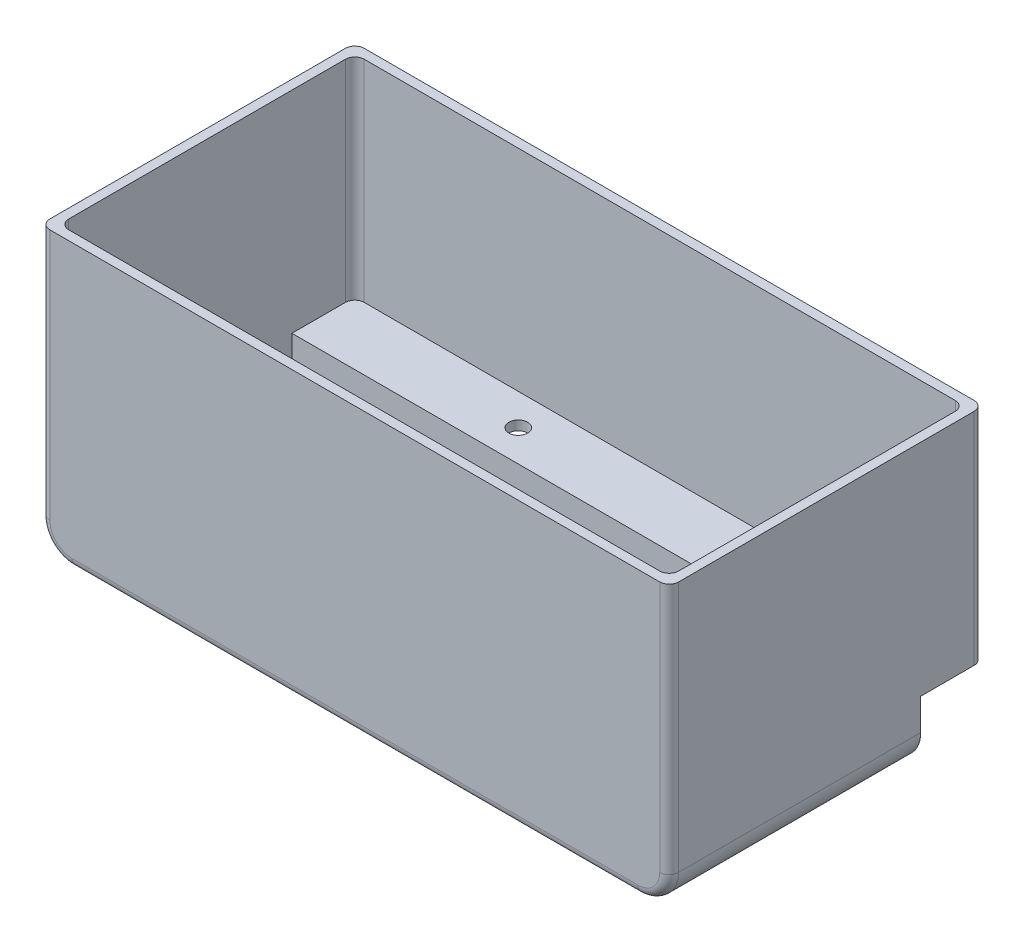
ISO-10303-21;
HEADER;
FILE_DESCRIPTION(('STEP AP214'),'2;1');
FILE_NAME('part.step','',(''),(''),'','','');
FILE_SCHEMA(('AUTOMOTIVE_DESIGN { 1 0 10303 214 1 1 1 1 }'));
ENDSEC;
DATA;
#1=APPLICATION_CONTEXT('core data for automotive mechanical design processes');
#2=APPLICATION_PROTOCOL_DEFINITION('international standard','automotive_design',2000,#1);
#3=PRODUCT_CONTEXT('',#1,'mechanical');
#4=PRODUCT('Part','Part','',(#3));
#5=PRODUCT_RELATED_PRODUCT_CATEGORY('part','',(#4));
#6=PRODUCT_DEFINITION_FORMATION('','',#4);
#7=PRODUCT_DEFINITION_CONTEXT('part definition',#1,'design');
#8=PRODUCT_DEFINITION('design','',#6,#7);
#9=PRODUCT_DEFINITION_SHAPE('','',#8);
#10=(LENGTH_UNIT() NAMED_UNIT(*) SI_UNIT(.MILLI.,.METRE.));
#11=(NAMED_UNIT(*) PLANE_ANGLE_UNIT() SI_UNIT($,.RADIAN.));
#12=(NAMED_UNIT(*) SI_UNIT($,.STERADIAN.) SOLID_ANGLE_UNIT());
#13=UNCERTAINTY_MEASURE_WITH_UNIT(LENGTH_MEASURE(1.E-05),#10,'distance_accuracy_value','');
#14=(GEOMETRIC_REPRESENTATION_CONTEXT(3) GLOBAL_UNCERTAINTY_ASSIGNED_CONTEXT((#13)) GLOBAL_UNIT_ASSIGNED_CONTEXT((#10,
#11,#12)) REPRESENTATION_CONTEXT('',''));
#15=CARTESIAN_POINT('',(0.,0.,0.));
#16=DIRECTION('',(0.,0.,1.));
#17=DIRECTION('',(1.,0.,0.));
#18=AXIS2_PLACEMENT_3D('',#15,#16,#17);
#19=CARTESIAN_POINT('',(0.,90.,0.));
#20=DIRECTION('',(0.,-1.,0.));
#21=DIRECTION('',(0.,0.,-1.));
#22=AXIS2_PLACEMENT_3D('',#19,#20,#21);
#23=PLANE('',#22);
#24=DIRECTION('',(0.,0.,1.));
#25=VECTOR('',#24,1.);
#26=CARTESIAN_POINT('',(-100.,90.,50.));
#27=LINE('',#26,#25);
#28=CARTESIAN_POINT('',(-100.,90.,-47.));
#29=VERTEX_POINT('',#28);
#30=CARTESIAN_POINT('',(-100.,90.,47.));
#31=VERTEX_POINT('',#30);
#32=EDGE_CURVE('E312',#29,#31,#27,.T.);
#33=ORIENTED_EDGE('',*,*,#32,.T.);
#34=CARTESIAN_POINT('',(-97.,90.,47.));
#35=DIRECTION('',(0.,-1.,0.));
#36=DIRECTION('',(0.,0.,-1.));
#37=AXIS2_PLACEMENT_3D('',#34,#35,#36);
#38=CIRCLE('',#37,3.);
#39=CARTESIAN_POINT('',(-97.,90.,50.));
#40=VERTEX_POINT('',#39);
#41=EDGE_CURVE('E431',#31,#40,#38,.F.);
#42=ORIENTED_EDGE('',*,*,#41,.T.);
#43=DIRECTION('',(1.,0.,0.));
#44=VECTOR('',#43,1.);
#45=CARTESIAN_POINT('',(-100.,90.,50.));
#46=LINE('',#45,#44);
#47=CARTESIAN_POINT('',(97.,90.,50.));
#48=VERTEX_POINT('',#47);
#49=EDGE_CURVE('E316',#40,#48,#46,.T.);
#50=ORIENTED_EDGE('',*,*,#49,.T.);
#51=CARTESIAN_POINT('',(97.,90.,47.));
#52=DIRECTION('',(0.,-1.,0.));
#53=DIRECTION('',(0.,0.,-1.));
#54=AXIS2_PLACEMENT_3D('',#51,#52,#53);
#55=CIRCLE('',#54,3.);
#56=CARTESIAN_POINT('',(100.,90.,47.));
#57=VERTEX_POINT('',#56);
#58=EDGE_CURVE('E428',#48,#57,#55,.F.);
#59=ORIENTED_EDGE('',*,*,#58,.T.);
#60=DIRECTION('',(0.,0.,-1.));
#61=VECTOR('',#60,1.);
#62=CARTESIAN_POINT('',(100.,90.,50.));
#63=LINE('',#62,#61);
#64=CARTESIAN_POINT('',(100.,90.,-47.));
#65=VERTEX_POINT('',#64);
#66=EDGE_CURVE('E298',#57,#65,#63,.T.);
#67=ORIENTED_EDGE('',*,*,#66,.T.);
#68=CARTESIAN_POINT('',(97.,90.,-47.));
#69=DIRECTION('',(0.,-1.,0.));
#70=DIRECTION('',(0.,0.,-1.));
#71=AXIS2_PLACEMENT_3D('',#68,#69,#70);
#72=CIRCLE('',#71,3.);
#73=CARTESIAN_POINT('',(97.,90.,-50.));
#74=VERTEX_POINT('',#73);
#75=EDGE_CURVE('E422',#65,#74,#72,.F.);
#76=ORIENTED_EDGE('',*,*,#75,.T.);
#77=DIRECTION('',(-1.,0.,0.));
#78=VECTOR('',#77,1.);
#79=CARTESIAN_POINT('',(-100.,90.,-50.));
#80=LINE('',#79,#78);
#81=CARTESIAN_POINT('',(-97.,90.,-50.));
#82=VERTEX_POINT('',#81);
#83=EDGE_CURVE('E308',#74,#82,#80,.T.);
#84=ORIENTED_EDGE('',*,*,#83,.T.);
#85=CARTESIAN_POINT('',(-97.,90.,-47.));
#86=DIRECTION('',(0.,-1.,0.));
#87=DIRECTION('',(0.,0.,-1.));
#88=AXIS2_PLACEMENT_3D('',#85,#86,#87);
#89=CIRCLE('',#88,3.);
#90=EDGE_CURVE('E425',#82,#29,#89,.F.);
#91=ORIENTED_EDGE('',*,*,#90,.T.);
#92=EDGE_LOOP('',(#33,#42,#50,#59,#67,#76,#84,#91));
#93=FACE_BOUND('',#92,.T.);
#94=DIRECTION('',(0.,0.,-1.));
#95=VECTOR('',#94,1.);
#96=CARTESIAN_POINT('',(97.,90.,0.));
#97=LINE('',#96,#95);
#98=CARTESIAN_POINT('',(97.,90.,44.));
#99=VERTEX_POINT('',#98);
#100=CARTESIAN_POINT('',(97.,90.,-44.));
#101=VERTEX_POINT('',#100);
#102=EDGE_CURVE('E242',#99,#101,#97,.T.);
#103=ORIENTED_EDGE('',*,*,#102,.F.);
#104=CARTESIAN_POINT('',(94.,90.,44.));
#105=DIRECTION('',(0.,-1.,0.));
#106=DIRECTION('',(0.,0.,-1.));
#107=AXIS2_PLACEMENT_3D('',#104,#105,#106);
#108=CIRCLE('',#107,3.);
#109=CARTESIAN_POINT('',(94.,90.,47.));
#110=VERTEX_POINT('',#109);
#111=EDGE_CURVE('E453',#99,#110,#108,.T.);
#112=ORIENTED_EDGE('',*,*,#111,.T.);
#113=DIRECTION('',(1.,0.,0.));
#114=VECTOR('',#113,1.);
#115=CARTESIAN_POINT('',(0.,90.,47.));
#116=LINE('',#115,#114);
#117=CARTESIAN_POINT('',(-94.,90.,47.));
#118=VERTEX_POINT('',#117);
#119=EDGE_CURVE('E275',#118,#110,#116,.T.);
#120=ORIENTED_EDGE('',*,*,#119,.F.);
#121=CARTESIAN_POINT('',(-94.,90.,44.));
#122=DIRECTION('',(0.,-1.,0.));
#123=DIRECTION('',(0.,0.,-1.));
#124=AXIS2_PLACEMENT_3D('',#121,#122,#123);
#125=CIRCLE('',#124,3.);
#126=CARTESIAN_POINT('',(-97.,90.,44.));
#127=VERTEX_POINT('',#126);
#128=EDGE_CURVE('E53',#118,#127,#125,.T.);
#129=ORIENTED_EDGE('',*,*,#128,.T.);
#130=DIRECTION('',(0.,0.,1.));
#131=VECTOR('',#130,1.);
#132=CARTESIAN_POINT('',(-97.,90.,0.));
#133=LINE('',#132,#131);
#134=CARTESIAN_POINT('',(-97.,90.,-44.));
#135=VERTEX_POINT('',#134);
#136=EDGE_CURVE('E271',#135,#127,#133,.T.);
#137=ORIENTED_EDGE('',*,*,#136,.F.);
#138=CARTESIAN_POINT('',(-94.,90.,-44.));
#139=DIRECTION('',(0.,-1.,0.));
#140=DIRECTION('',(0.,0.,-1.));
#141=AXIS2_PLACEMENT_3D('',#138,#139,#140);
#142=CIRCLE('',#141,3.);
#143=CARTESIAN_POINT('',(-94.,90.,-47.));
#144=VERTEX_POINT('',#143);
#145=EDGE_CURVE('E11',#135,#144,#142,.T.);
#146=ORIENTED_EDGE('',*,*,#145,.T.);
#147=DIRECTION('',(-1.,0.,0.));
#148=VECTOR('',#147,1.);
#149=CARTESIAN_POINT('',(0.,90.,-47.));
#150=LINE('',#149,#148);
#151=CARTESIAN_POINT('',(94.,90.,-47.));
#152=VERTEX_POINT('',#151);
#153=EDGE_CURVE('E267',#152,#144,#150,.T.);
#154=ORIENTED_EDGE('',*,*,#153,.F.);
#155=CARTESIAN_POINT('',(94.,90.,-44.));
#156=DIRECTION('',(0.,-1.,0.));
#157=DIRECTION('',(0.,0.,-1.));
#158=AXIS2_PLACEMENT_3D('',#155,#156,#157);
#159=CIRCLE('',#158,3.);
#160=EDGE_CURVE('E450',#152,#101,#159,.T.);
#161=ORIENTED_EDGE('',*,*,#160,.T.);
#162=EDGE_LOOP('',(#103,#112,#120,#129,#137,#146,#154,#161));
#163=FACE_BOUND('',#162,.T.);
#164=ADVANCED_FACE('F43',(#93,#163),#23,.F.);
#165=CARTESIAN_POINT('',(100.,90.,50.));
#166=DIRECTION('',(-1.,0.,0.));
#167=DIRECTION('',(0.,0.,1.));
#168=AXIS2_PLACEMENT_3D('',#165,#166,#167);
#169=PLANE('',#168);
#170=ORIENTED_EDGE('',*,*,#66,.F.);
#171=DIRECTION('',(0.,-1.,0.));
#172=VECTOR('',#171,1.);
#173=CARTESIAN_POINT('',(100.,90.,47.));
#174=LINE('',#173,#172);
#175=CARTESIAN_POINT('',(100.,9.99999999999999,47.));
#176=VERTEX_POINT('',#175);
#177=EDGE_CURVE('E437',#57,#176,#174,.T.);
#178=ORIENTED_EDGE('',*,*,#177,.T.);
#179=DIRECTION('',(0.,0.,-1.));
#180=VECTOR('',#179,1.);
#181=CARTESIAN_POINT('',(100.,9.99999999999999,-30.));
#182=LINE('',#181,#180);
#183=CARTESIAN_POINT('',(100.,9.99999999999999,-30.));
#184=VERTEX_POINT('',#183);
#185=EDGE_CURVE('E337',#176,#184,#182,.T.);
#186=ORIENTED_EDGE('',*,*,#185,.T.);
#187=DIRECTION('',(0.,-1.,0.));
#188=VECTOR('',#187,1.);
#189=CARTESIAN_POINT('',(100.,0.,-30.));
#190=LINE('',#189,#188);
#191=CARTESIAN_POINT('',(100.,20.,-30.));
#192=VERTEX_POINT('',#191);
#193=EDGE_CURVE('E284',#192,#184,#190,.T.);
#194=ORIENTED_EDGE('',*,*,#193,.F.);
#195=DIRECTION('',(0.,0.,1.));
#196=VECTOR('',#195,1.);
#197=CARTESIAN_POINT('',(100.,20.,-50.));
#198=LINE('',#197,#196);
#199=CARTESIAN_POINT('',(100.,20.,-47.));
#200=VERTEX_POINT('',#199);
#201=EDGE_CURVE('E255',#200,#192,#198,.T.);
#202=ORIENTED_EDGE('',*,*,#201,.F.);
#203=DIRECTION('',(0.,-1.,0.));
#204=VECTOR('',#203,1.);
#205=CARTESIAN_POINT('',(100.,90.,-47.));
#206=LINE('',#205,#204);
#207=EDGE_CURVE('E434',#200,#65,#206,.F.);
#208=ORIENTED_EDGE('',*,*,#207,.T.);
#209=EDGE_LOOP('',(#170,#178,#186,#194,#202,#208));
#210=FACE_BOUND('',#209,.T.);
#211=ADVANCED_FACE('F529',(#210),#169,.F.);
#212=CARTESIAN_POINT('',(-100.,90.,-50.));
#213=DIRECTION('',(0.,0.,1.));
#214=DIRECTION('',(1.,0.,0.));
#215=AXIS2_PLACEMENT_3D('',#212,#213,#214);
#216=PLANE('',#215);
#217=DIRECTION('',(1.,0.,0.));
#218=VECTOR('',#217,1.);
#219=CARTESIAN_POINT('',(-100.,20.,-50.));
#220=LINE('',#219,#218);
#221=CARTESIAN_POINT('',(-97.,20.,-50.));
#222=VERTEX_POINT('',#221);
#223=CARTESIAN_POINT('',(97.,20.,-50.));
#224=VERTEX_POINT('',#223);
#225=EDGE_CURVE('E288',#222,#224,#220,.T.);
#226=ORIENTED_EDGE('',*,*,#225,.F.);
#227=DIRECTION('',(0.,-1.,0.));
#228=VECTOR('',#227,1.);
#229=CARTESIAN_POINT('',(-97.,90.,-50.));
#230=LINE('',#229,#228);
#231=EDGE_CURVE('E447',#222,#82,#230,.F.);
#232=ORIENTED_EDGE('',*,*,#231,.T.);
#233=ORIENTED_EDGE('',*,*,#83,.F.);
#234=DIRECTION('',(0.,-1.,0.));
#235=VECTOR('',#234,1.);
#236=CARTESIAN_POINT('',(97.,90.,-50.));
#237=LINE('',#236,#235);
#238=EDGE_CURVE('E444',#74,#224,#237,.T.);
#239=ORIENTED_EDGE('',*,*,#238,.T.);
#240=EDGE_LOOP('',(#226,#232,#233,#239));
#241=FACE_BOUND('',#240,.T.);
#242=ADVANCED_FACE('F534',(#241),#216,.F.);
#243=CARTESIAN_POINT('',(-100.,90.,50.));
#244=DIRECTION('',(1.,0.,0.));
#245=DIRECTION('',(0.,0.,-1.));
#246=AXIS2_PLACEMENT_3D('',#243,#244,#245);
#247=PLANE('',#246);
#248=DIRECTION('',(0.,0.,1.));
#249=VECTOR('',#248,1.);
#250=CARTESIAN_POINT('',(-100.,9.99999999999999,50.));
#251=LINE('',#250,#249);
#252=CARTESIAN_POINT('',(-100.,9.99999999999999,-30.));
#253=VERTEX_POINT('',#252);
#254=CARTESIAN_POINT('',(-100.,9.99999999999999,47.));
#255=VERTEX_POINT('',#254);
#256=EDGE_CURVE('E320',#253,#255,#251,.T.);
#257=ORIENTED_EDGE('',*,*,#256,.T.);
#258=DIRECTION('',(0.,-1.,0.));
#259=VECTOR('',#258,1.);
#260=CARTESIAN_POINT('',(-100.,90.,47.));
#261=LINE('',#260,#259);
#262=EDGE_CURVE('E419',#255,#31,#261,.F.);
#263=ORIENTED_EDGE('',*,*,#262,.T.);
#264=ORIENTED_EDGE('',*,*,#32,.F.);
#265=DIRECTION('',(0.,-1.,0.));
#266=VECTOR('',#265,1.);
#267=CARTESIAN_POINT('',(-100.,90.,-47.));
#268=LINE('',#267,#266);
#269=CARTESIAN_POINT('',(-100.,20.,-47.));
#270=VERTEX_POINT('',#269);
#271=EDGE_CURVE('E415',#29,#270,#268,.T.);
#272=ORIENTED_EDGE('',*,*,#271,.T.);
#273=DIRECTION('',(0.,0.,1.));
#274=VECTOR('',#273,1.);
#275=CARTESIAN_POINT('',(-100.,20.,-50.));
#276=LINE('',#275,#274);
#277=CARTESIAN_POINT('',(-100.,20.,-30.));
#278=VERTEX_POINT('',#277);
#279=EDGE_CURVE('E280',#270,#278,#276,.T.);
#280=ORIENTED_EDGE('',*,*,#279,.T.);
#281=DIRECTION('',(0.,-1.,0.));
#282=VECTOR('',#281,1.);
#283=CARTESIAN_POINT('',(-100.,0.,-30.));
#284=LINE('',#283,#282);
#285=EDGE_CURVE('E283',#278,#253,#284,.T.);
#286=ORIENTED_EDGE('',*,*,#285,.T.);
#287=EDGE_LOOP('',(#257,#263,#264,#272,#280,#286));
#288=FACE_BOUND('',#287,.T.);
#289=ADVANCED_FACE('F548',(#288),#247,.F.);
#290=CARTESIAN_POINT('',(-100.,90.,50.));
#291=DIRECTION('',(0.,0.,-1.));
#292=DIRECTION('',(-1.,0.,0.));
#293=AXIS2_PLACEMENT_3D('',#290,#291,#292);
#294=PLANE('',#293);
#295=ORIENTED_EDGE('',*,*,#49,.F.);
#296=DIRECTION('',(0.,-1.,0.));
#297=VECTOR('',#296,1.);
#298=CARTESIAN_POINT('',(-97.,90.,50.));
#299=LINE('',#298,#297);
#300=CARTESIAN_POINT('',(-97.,9.99999999999999,50.));
#301=VERTEX_POINT('',#300);
#302=EDGE_CURVE('E377',#40,#301,#299,.T.);
#303=ORIENTED_EDGE('',*,*,#302,.T.);
#304=CARTESIAN_POINT('',(-90.,9.99999999999999,50.));
#305=DIRECTION('',(0.,0.,-1.));
#306=DIRECTION('',(-1.,0.,0.));
#307=AXIS2_PLACEMENT_3D('',#304,#305,#306);
#308=CIRCLE('',#307,7.);
#309=CARTESIAN_POINT('',(-90.,3.,50.));
#310=VERTEX_POINT('',#309);
#311=EDGE_CURVE('E373',#301,#310,#308,.F.);
#312=ORIENTED_EDGE('',*,*,#311,.T.);
#313=DIRECTION('',(1.,0.,0.));
#314=VECTOR('',#313,1.);
#315=CARTESIAN_POINT('',(90.,3.,50.));
#316=LINE('',#315,#314);
#317=CARTESIAN_POINT('',(90.,2.99999999999999,50.));
#318=VERTEX_POINT('',#317);
#319=EDGE_CURVE('E370',#310,#318,#316,.T.);
#320=ORIENTED_EDGE('',*,*,#319,.T.);
#321=CARTESIAN_POINT('',(90.,9.99999999999999,50.));
#322=DIRECTION('',(0.,0.,-1.));
#323=DIRECTION('',(-1.,0.,0.));
#324=AXIS2_PLACEMENT_3D('',#321,#322,#323);
#325=CIRCLE('',#324,7.);
#326=CARTESIAN_POINT('',(97.,9.99999999999999,50.));
#327=VERTEX_POINT('',#326);
#328=EDGE_CURVE('E367',#318,#327,#325,.F.);
#329=ORIENTED_EDGE('',*,*,#328,.T.);
#330=DIRECTION('',(0.,-1.,0.));
#331=VECTOR('',#330,1.);
#332=CARTESIAN_POINT('',(97.,90.,50.));
#333=LINE('',#332,#331);
#334=EDGE_CURVE('E364',#327,#48,#333,.F.);
#335=ORIENTED_EDGE('',*,*,#334,.T.);
#336=EDGE_LOOP('',(#295,#303,#312,#320,#329,#335));
#337=FACE_BOUND('',#336,.T.);
#338=ADVANCED_FACE('F502',(#337),#294,.F.);
#339=CARTESIAN_POINT('',(0.,0.,0.));
#340=DIRECTION('',(0.,-1.,0.));
#341=DIRECTION('',(0.,0.,-1.));
#342=AXIS2_PLACEMENT_3D('',#339,#340,#341);
#343=PLANE('',#342);
#344=DIRECTION('',(0.,0.,-1.));
#345=VECTOR('',#344,1.);
#346=CARTESIAN_POINT('',(90.,0.,50.));
#347=LINE('',#346,#345);
#348=CARTESIAN_POINT('',(90.,0.,-30.));
#349=VERTEX_POINT('',#348);
#350=CARTESIAN_POINT('',(90.,0.,47.));
#351=VERTEX_POINT('',#350);
#352=EDGE_CURVE('E324',#349,#351,#347,.F.);
#353=ORIENTED_EDGE('',*,*,#352,.T.);
#354=DIRECTION('',(1.,0.,0.));
#355=VECTOR('',#354,1.);
#356=CARTESIAN_POINT('',(-90.,0.,47.));
#357=LINE('',#356,#355);
#358=CARTESIAN_POINT('',(-90.,0.,47.));
#359=VERTEX_POINT('',#358);
#360=EDGE_CURVE('E383',#351,#359,#357,.F.);
#361=ORIENTED_EDGE('',*,*,#360,.T.);
#362=DIRECTION('',(0.,0.,1.));
#363=VECTOR('',#362,1.);
#364=CARTESIAN_POINT('',(-90.,0.,-30.));
#365=LINE('',#364,#363);
#366=CARTESIAN_POINT('',(-90.,0.,-30.));
#367=VERTEX_POINT('',#366);
#368=EDGE_CURVE('E328',#359,#367,#365,.F.);
#369=ORIENTED_EDGE('',*,*,#368,.T.);
#370=DIRECTION('',(1.,0.,0.));
#371=VECTOR('',#370,1.);
#372=CARTESIAN_POINT('',(-100.,0.,-30.));
#373=LINE('',#372,#371);
#374=EDGE_CURVE('E294',#367,#349,#373,.T.);
#375=ORIENTED_EDGE('',*,*,#374,.T.);
#376=EDGE_LOOP('',(#353,#361,#369,#375));
#377=FACE_BOUND('',#376,.T.);
#378=ADVANCED_FACE('F541',(#377),#343,.T.);
#379=CARTESIAN_POINT('',(-100.,0.,-30.));
#380=DIRECTION('',(0.,0.,1.));
#381=DIRECTION('',(1.,0.,0.));
#382=AXIS2_PLACEMENT_3D('',#379,#380,#381);
#383=PLANE('',#382);
#384=ORIENTED_EDGE('',*,*,#374,.F.);
#385=CARTESIAN_POINT('',(-90.,9.99999999999999,-30.));
#386=DIRECTION('',(0.,0.,1.));
#387=DIRECTION('',(1.,0.,0.));
#388=AXIS2_PLACEMENT_3D('',#385,#386,#387);
#389=CIRCLE('',#388,10.);
#390=EDGE_CURVE('E334',#367,#253,#389,.F.);
#391=ORIENTED_EDGE('',*,*,#390,.T.);
#392=ORIENTED_EDGE('',*,*,#285,.F.);
#393=DIRECTION('',(1.,0.,0.));
#394=VECTOR('',#393,1.);
#395=CARTESIAN_POINT('',(-100.,20.,-30.));
#396=LINE('',#395,#394);
#397=EDGE_CURVE('E299',#278,#192,#396,.T.);
#398=ORIENTED_EDGE('',*,*,#397,.T.);
#399=ORIENTED_EDGE('',*,*,#193,.T.);
#400=CARTESIAN_POINT('',(90.,9.99999999999999,-30.));
#401=DIRECTION('',(0.,0.,1.));
#402=DIRECTION('',(1.,0.,0.));
#403=AXIS2_PLACEMENT_3D('',#400,#401,#402);
#404=CIRCLE('',#403,10.);
#405=EDGE_CURVE('E331',#184,#349,#404,.F.);
#406=ORIENTED_EDGE('',*,*,#405,.T.);
#407=EDGE_LOOP('',(#384,#391,#392,#398,#399,#406));
#408=FACE_BOUND('',#407,.T.);
#409=ADVANCED_FACE('F544',(#408),#383,.F.);
#410=CARTESIAN_POINT('',(-100.,20.,-50.));
#411=DIRECTION('',(0.,1.,0.));
#412=DIRECTION('',(0.,0.,1.));
#413=AXIS2_PLACEMENT_3D('',#410,#411,#412);
#414=PLANE('',#413);
#415=CARTESIAN_POINT('',(-35.,20.,-37.));
#416=DIRECTION('',(0.,1.,0.));
#417=DIRECTION('',(0.,0.,1.));
#418=AXIS2_PLACEMENT_3D('',#415,#416,#417);
#419=CIRCLE('',#418,3.);
#420=CARTESIAN_POINT('',(-35.,20.,-34.));
#421=VERTEX_POINT('',#420);
#422=EDGE_CURVE('E478',#421,#421,#419,.T.);
#423=ORIENTED_EDGE('',*,*,#422,.T.);
#424=EDGE_LOOP('',(#423));
#425=FACE_BOUND('',#424,.T.);
#426=CARTESIAN_POINT('',(35.,20.,-37.));
#427=DIRECTION('',(0.,1.,0.));
#428=DIRECTION('',(0.,0.,1.));
#429=AXIS2_PLACEMENT_3D('',#426,#427,#428);
#430=CIRCLE('',#429,3.);
#431=CARTESIAN_POINT('',(35.,20.,-34.));
#432=VERTEX_POINT('',#431);
#433=EDGE_CURVE('E903',#432,#432,#430,.T.);
#434=ORIENTED_EDGE('',*,*,#433,.T.);
#435=EDGE_LOOP('',(#434));
#436=FACE_BOUND('',#435,.T.);
#437=ORIENTED_EDGE('',*,*,#279,.F.);
#438=CARTESIAN_POINT('',(-97.,20.,-47.));
#439=DIRECTION('',(0.,1.,0.));
#440=DIRECTION('',(0.,0.,1.));
#441=AXIS2_PLACEMENT_3D('',#438,#439,#440);
#442=CIRCLE('',#441,3.);
#443=EDGE_CURVE('E69',#270,#222,#442,.F.);
#444=ORIENTED_EDGE('',*,*,#443,.T.);
#445=ORIENTED_EDGE('',*,*,#225,.T.);
#446=CARTESIAN_POINT('',(97.,20.,-47.));
#447=DIRECTION('',(0.,1.,0.));
#448=DIRECTION('',(0.,0.,1.));
#449=AXIS2_PLACEMENT_3D('',#446,#447,#448);
#450=CIRCLE('',#449,3.);
#451=EDGE_CURVE('E61',#224,#200,#450,.F.);
#452=ORIENTED_EDGE('',*,*,#451,.T.);
#453=ORIENTED_EDGE('',*,*,#201,.T.);
#454=ORIENTED_EDGE('',*,*,#397,.F.);
#455=EDGE_LOOP('',(#437,#444,#445,#452,#453,#454));
#456=FACE_BOUND('',#455,.T.);
#457=ADVANCED_FACE('F539',(#425,#436,#456),#414,.F.);
#458=CARTESIAN_POINT('',(-90.,9.99999999999999,50.));
#459=DIRECTION('',(0.,0.,-1.));
#460=DIRECTION('',(-1.,0.,0.));
#461=AXIS2_PLACEMENT_3D('',#458,#459,#460);
#462=CYLINDRICAL_SURFACE('',#461,10.);
#463=ORIENTED_EDGE('',*,*,#368,.F.);
#464=CARTESIAN_POINT('',(-90.,9.99999999999999,47.));
#465=DIRECTION('',(0.,0.,-1.));
#466=DIRECTION('',(-1.,0.,0.));
#467=AXIS2_PLACEMENT_3D('',#464,#465,#466);
#468=CIRCLE('',#467,10.);
#469=EDGE_CURVE('E380',#359,#255,#468,.T.);
#470=ORIENTED_EDGE('',*,*,#469,.T.);
#471=ORIENTED_EDGE('',*,*,#256,.F.);
#472=ORIENTED_EDGE('',*,*,#390,.F.);
#473=EDGE_LOOP('',(#463,#470,#471,#472));
#474=FACE_BOUND('',#473,.T.);
#475=ADVANCED_FACE('F555',(#474),#462,.T.);
#476=CARTESIAN_POINT('',(90.,9.99999999999999,50.));
#477=DIRECTION('',(0.,0.,1.));
#478=DIRECTION('',(1.,0.,0.));
#479=AXIS2_PLACEMENT_3D('',#476,#477,#478);
#480=CYLINDRICAL_SURFACE('',#479,10.);
#481=ORIENTED_EDGE('',*,*,#185,.F.);
#482=CARTESIAN_POINT('',(90.,9.99999999999999,47.));
#483=DIRECTION('',(0.,0.,-1.));
#484=DIRECTION('',(-1.,0.,0.));
#485=AXIS2_PLACEMENT_3D('',#482,#483,#484);
#486=CIRCLE('',#485,10.);
#487=EDGE_CURVE('E386',#176,#351,#486,.T.);
#488=ORIENTED_EDGE('',*,*,#487,.T.);
#489=ORIENTED_EDGE('',*,*,#352,.F.);
#490=ORIENTED_EDGE('',*,*,#405,.F.);
#491=EDGE_LOOP('',(#481,#488,#489,#490));
#492=FACE_BOUND('',#491,.T.);
#493=ADVANCED_FACE('F558',(#492),#480,.T.);
#494=CARTESIAN_POINT('',(97.,90.,50.));
#495=DIRECTION('',(-1.,0.,0.));
#496=DIRECTION('',(0.,0.,1.));
#497=AXIS2_PLACEMENT_3D('',#494,#495,#496);
#498=PLANE('',#497);
#499=ORIENTED_EDGE('',*,*,#102,.T.);
#500=DIRECTION('',(0.,-1.,0.));
#501=VECTOR('',#500,1.);
#502=CARTESIAN_POINT('',(97.,23.,-44.));
#503=LINE('',#502,#501);
#504=CARTESIAN_POINT('',(97.,23.,-44.));
#505=VERTEX_POINT('',#504);
#506=EDGE_CURVE('E392',#101,#505,#503,.T.);
#507=ORIENTED_EDGE('',*,*,#506,.T.);
#508=DIRECTION('',(0.,0.,1.));
#509=VECTOR('',#508,1.);
#510=CARTESIAN_POINT('',(97.,23.,-50.));
#511=LINE('',#510,#509);
#512=CARTESIAN_POINT('',(97.,23.,-27.));
#513=VERTEX_POINT('',#512);
#514=EDGE_CURVE('E473',#505,#513,#511,.T.);
#515=ORIENTED_EDGE('',*,*,#514,.T.);
#516=DIRECTION('',(0.,-1.,0.));
#517=VECTOR('',#516,1.);
#518=CARTESIAN_POINT('',(97.,0.,-27.));
#519=LINE('',#518,#517);
#520=CARTESIAN_POINT('',(97.,10.,-27.));
#521=VERTEX_POINT('',#520);
#522=EDGE_CURVE('E915',#513,#521,#519,.T.);
#523=ORIENTED_EDGE('',*,*,#522,.T.);
#524=DIRECTION('',(0.,0.,1.));
#525=VECTOR('',#524,1.);
#526=CARTESIAN_POINT('',(97.,10.,50.));
#527=LINE('',#526,#525);
#528=CARTESIAN_POINT('',(97.,10.,44.));
#529=VERTEX_POINT('',#528);
#530=EDGE_CURVE('E251',#529,#521,#527,.F.);
#531=ORIENTED_EDGE('',*,*,#530,.F.);
#532=DIRECTION('',(0.,-1.,0.));
#533=VECTOR('',#532,1.);
#534=CARTESIAN_POINT('',(97.,90.,44.));
#535=LINE('',#534,#533);
#536=EDGE_CURVE('E389',#529,#99,#535,.F.);
#537=ORIENTED_EDGE('',*,*,#536,.T.);
#538=EDGE_LOOP('',(#499,#507,#515,#523,#531,#537));
#539=FACE_BOUND('',#538,.T.);
#540=ADVANCED_FACE('F562',(#539),#498,.T.);
#541=CARTESIAN_POINT('',(-100.,90.,-47.));
#542=DIRECTION('',(0.,0.,1.));
#543=DIRECTION('',(1.,0.,0.));
#544=AXIS2_PLACEMENT_3D('',#541,#542,#543);
#545=PLANE('',#544);
#546=DIRECTION('',(1.,0.,0.));
#547=VECTOR('',#546,1.);
#548=CARTESIAN_POINT('',(-100.,23.,-47.));
#549=LINE('',#548,#547);
#550=CARTESIAN_POINT('',(-94.,23.,-47.));
#551=VERTEX_POINT('',#550);
#552=CARTESIAN_POINT('',(94.,23.,-47.));
#553=VERTEX_POINT('',#552);
#554=EDGE_CURVE('E262',#551,#553,#549,.T.);
#555=ORIENTED_EDGE('',*,*,#554,.T.);
#556=DIRECTION('',(0.,-1.,0.));
#557=VECTOR('',#556,1.);
#558=CARTESIAN_POINT('',(94.,90.,-47.));
#559=LINE('',#558,#557);
#560=EDGE_CURVE('E406',#553,#152,#559,.F.);
#561=ORIENTED_EDGE('',*,*,#560,.T.);
#562=ORIENTED_EDGE('',*,*,#153,.T.);
#563=DIRECTION('',(0.,-1.,0.));
#564=VECTOR('',#563,1.);
#565=CARTESIAN_POINT('',(-94.,23.,-47.));
#566=LINE('',#565,#564);
#567=EDGE_CURVE('E402',#144,#551,#566,.T.);
#568=ORIENTED_EDGE('',*,*,#567,.T.);
#569=EDGE_LOOP('',(#555,#561,#562,#568));
#570=FACE_BOUND('',#569,.T.);
#571=ADVANCED_FACE('F609',(#570),#545,.T.);
#572=CARTESIAN_POINT('',(-97.,90.,50.));
#573=DIRECTION('',(1.,0.,0.));
#574=DIRECTION('',(0.,0.,-1.));
#575=AXIS2_PLACEMENT_3D('',#572,#573,#574);
#576=PLANE('',#575);
#577=ORIENTED_EDGE('',*,*,#136,.T.);
#578=DIRECTION('',(0.,-1.,0.));
#579=VECTOR('',#578,1.);
#580=CARTESIAN_POINT('',(-97.,10.,44.));
#581=LINE('',#580,#579);
#582=CARTESIAN_POINT('',(-97.,10.,44.));
#583=VERTEX_POINT('',#582);
#584=EDGE_CURVE('E412',#127,#583,#581,.T.);
#585=ORIENTED_EDGE('',*,*,#584,.T.);
#586=DIRECTION('',(0.,0.,-1.));
#587=VECTOR('',#586,1.);
#588=CARTESIAN_POINT('',(-97.,10.,50.));
#589=LINE('',#588,#587);
#590=CARTESIAN_POINT('',(-97.,10.,-27.));
#591=VERTEX_POINT('',#590);
#592=EDGE_CURVE('E279',#591,#583,#589,.F.);
#593=ORIENTED_EDGE('',*,*,#592,.F.);
#594=DIRECTION('',(0.,-1.,0.));
#595=VECTOR('',#594,1.);
#596=CARTESIAN_POINT('',(-97.,90.,-27.));
#597=LINE('',#596,#595);
#598=CARTESIAN_POINT('',(-97.,23.,-27.));
#599=VERTEX_POINT('',#598);
#600=EDGE_CURVE('E248',#599,#591,#597,.T.);
#601=ORIENTED_EDGE('',*,*,#600,.F.);
#602=DIRECTION('',(0.,0.,1.));
#603=VECTOR('',#602,1.);
#604=CARTESIAN_POINT('',(-97.,23.,50.));
#605=LINE('',#604,#603);
#606=CARTESIAN_POINT('',(-97.,23.,-44.));
#607=VERTEX_POINT('',#606);
#608=EDGE_CURVE('E601',#607,#599,#605,.T.);
#609=ORIENTED_EDGE('',*,*,#608,.F.);
#610=DIRECTION('',(0.,-1.,0.));
#611=VECTOR('',#610,1.);
#612=CARTESIAN_POINT('',(-97.,90.,-44.));
#613=LINE('',#612,#611);
#614=EDGE_CURVE('E409',#607,#135,#613,.F.);
#615=ORIENTED_EDGE('',*,*,#614,.T.);
#616=EDGE_LOOP('',(#577,#585,#593,#601,#609,#615));
#617=FACE_BOUND('',#616,.T.);
#618=ADVANCED_FACE('F598',(#617),#576,.T.);
#619=CARTESIAN_POINT('',(-100.,90.,47.));
#620=DIRECTION('',(0.,0.,-1.));
#621=DIRECTION('',(-1.,0.,0.));
#622=AXIS2_PLACEMENT_3D('',#619,#620,#621);
#623=PLANE('',#622);
#624=ORIENTED_EDGE('',*,*,#119,.T.);
#625=DIRECTION('',(0.,-1.,0.));
#626=VECTOR('',#625,1.);
#627=CARTESIAN_POINT('',(94.,10.,47.));
#628=LINE('',#627,#626);
#629=CARTESIAN_POINT('',(94.,10.,47.));
#630=VERTEX_POINT('',#629);
#631=EDGE_CURVE('E356',#110,#630,#628,.T.);
#632=ORIENTED_EDGE('',*,*,#631,.T.);
#633=CARTESIAN_POINT('',(90.,9.99999999999999,47.));
#634=DIRECTION('',(0.,0.,-1.));
#635=DIRECTION('',(-1.,0.,0.));
#636=AXIS2_PLACEMENT_3D('',#633,#634,#635);
#637=CIRCLE('',#636,4.);
#638=CARTESIAN_POINT('',(90.,6.,47.));
#639=VERTEX_POINT('',#638);
#640=EDGE_CURVE('E353',#630,#639,#637,.T.);
#641=ORIENTED_EDGE('',*,*,#640,.T.);
#642=DIRECTION('',(1.,0.,0.));
#643=VECTOR('',#642,1.);
#644=CARTESIAN_POINT('',(-100.,6.00000000000001,47.));
#645=LINE('',#644,#643);
#646=CARTESIAN_POINT('',(-90.,5.99999999999999,47.));
#647=VERTEX_POINT('',#646);
#648=EDGE_CURVE('E350',#639,#647,#645,.F.);
#649=ORIENTED_EDGE('',*,*,#648,.T.);
#650=CARTESIAN_POINT('',(-90.,9.99999999999999,47.));
#651=DIRECTION('',(0.,0.,-1.));
#652=DIRECTION('',(-1.,0.,0.));
#653=AXIS2_PLACEMENT_3D('',#650,#651,#652);
#654=CIRCLE('',#653,4.);
#655=CARTESIAN_POINT('',(-94.,10.,47.));
#656=VERTEX_POINT('',#655);
#657=EDGE_CURVE('E347',#647,#656,#654,.T.);
#658=ORIENTED_EDGE('',*,*,#657,.T.);
#659=DIRECTION('',(0.,-1.,0.));
#660=VECTOR('',#659,1.);
#661=CARTESIAN_POINT('',(-94.,90.,47.));
#662=LINE('',#661,#660);
#663=EDGE_CURVE('E344',#656,#118,#662,.F.);
#664=ORIENTED_EDGE('',*,*,#663,.T.);
#665=EDGE_LOOP('',(#624,#632,#641,#649,#658,#664));
#666=FACE_BOUND('',#665,.T.);
#667=ADVANCED_FACE('F627',(#666),#623,.T.);
#668=CARTESIAN_POINT('',(0.,3.,0.));
#669=DIRECTION('',(0.,-1.,0.));
#670=DIRECTION('',(0.,0.,-1.));
#671=AXIS2_PLACEMENT_3D('',#668,#669,#670);
#672=PLANE('',#671);
#673=DIRECTION('',(0.,0.,-1.));
#674=VECTOR('',#673,1.);
#675=CARTESIAN_POINT('',(-90.,3.,0.));
#676=LINE('',#675,#674);
#677=CARTESIAN_POINT('',(-90.,3.,44.));
#678=VERTEX_POINT('',#677);
#679=CARTESIAN_POINT('',(-90.,3.,-27.));
#680=VERTEX_POINT('',#679);
#681=EDGE_CURVE('E219',#678,#680,#676,.T.);
#682=ORIENTED_EDGE('',*,*,#681,.F.);
#683=DIRECTION('',(1.,0.,0.));
#684=VECTOR('',#683,1.);
#685=CARTESIAN_POINT('',(0.,3.,44.));
#686=LINE('',#685,#684);
#687=CARTESIAN_POINT('',(90.,3.,44.));
#688=VERTEX_POINT('',#687);
#689=EDGE_CURVE('E359',#678,#688,#686,.T.);
#690=ORIENTED_EDGE('',*,*,#689,.T.);
#691=DIRECTION('',(0.,0.,-1.));
#692=VECTOR('',#691,1.);
#693=CARTESIAN_POINT('',(90.,3.,0.));
#694=LINE('',#693,#692);
#695=CARTESIAN_POINT('',(90.,3.,-27.));
#696=VERTEX_POINT('',#695);
#697=EDGE_CURVE('E232',#696,#688,#694,.F.);
#698=ORIENTED_EDGE('',*,*,#697,.F.);
#699=DIRECTION('',(1.,0.,0.));
#700=VECTOR('',#699,1.);
#701=CARTESIAN_POINT('',(-100.,3.,-27.));
#702=LINE('',#701,#700);
#703=EDGE_CURVE('E236',#680,#696,#702,.T.);
#704=ORIENTED_EDGE('',*,*,#703,.F.);
#705=EDGE_LOOP('',(#682,#690,#698,#704));
#706=FACE_BOUND('',#705,.T.);
#707=ADVANCED_FACE('F237',(#706),#672,.F.);
#708=CARTESIAN_POINT('',(-100.,0.,-27.));
#709=DIRECTION('',(0.,0.,1.));
#710=DIRECTION('',(1.,0.,0.));
#711=AXIS2_PLACEMENT_3D('',#708,#709,#710);
#712=PLANE('',#711);
#713=ORIENTED_EDGE('',*,*,#703,.T.);
#714=CARTESIAN_POINT('',(90.,9.99999999999999,-27.));
#715=DIRECTION('',(0.,0.,1.));
#716=DIRECTION('',(1.,0.,0.));
#717=AXIS2_PLACEMENT_3D('',#714,#715,#716);
#718=CIRCLE('',#717,7.);
#719=EDGE_CURVE('E231',#521,#696,#718,.F.);
#720=ORIENTED_EDGE('',*,*,#719,.F.);
#721=ORIENTED_EDGE('',*,*,#522,.F.);
#722=DIRECTION('',(1.,0.,0.));
#723=VECTOR('',#722,1.);
#724=CARTESIAN_POINT('',(-100.,23.,-27.));
#725=LINE('',#724,#723);
#726=EDGE_CURVE('E243',#599,#513,#725,.T.);
#727=ORIENTED_EDGE('',*,*,#726,.F.);
#728=ORIENTED_EDGE('',*,*,#600,.T.);
#729=CARTESIAN_POINT('',(-90.,9.99999999999999,-27.));
#730=DIRECTION('',(0.,0.,1.));
#731=DIRECTION('',(1.,0.,0.));
#732=AXIS2_PLACEMENT_3D('',#729,#730,#731);
#733=CIRCLE('',#732,7.);
#734=EDGE_CURVE('E224',#680,#591,#733,.F.);
#735=ORIENTED_EDGE('',*,*,#734,.F.);
#736=EDGE_LOOP('',(#713,#720,#721,#727,#728,#735));
#737=FACE_BOUND('',#736,.T.);
#738=ADVANCED_FACE('F245',(#737),#712,.T.);
#739=CARTESIAN_POINT('',(-100.,23.,-50.));
#740=DIRECTION('',(0.,1.,0.));
#741=DIRECTION('',(0.,0.,1.));
#742=AXIS2_PLACEMENT_3D('',#739,#740,#741);
#743=PLANE('',#742);
#744=CARTESIAN_POINT('',(-35.,23.,-37.));
#745=DIRECTION('',(0.,1.,0.));
#746=DIRECTION('',(0.,0.,1.));
#747=AXIS2_PLACEMENT_3D('',#744,#745,#746);
#748=CIRCLE('',#747,3.);
#749=CARTESIAN_POINT('',(-35.,23.,-34.));
#750=VERTEX_POINT('',#749);
#751=EDGE_CURVE('E901',#750,#750,#748,.T.);
#752=ORIENTED_EDGE('',*,*,#751,.F.);
#753=EDGE_LOOP('',(#752));
#754=FACE_BOUND('',#753,.T.);
#755=CARTESIAN_POINT('',(35.,23.,-37.));
#756=DIRECTION('',(0.,1.,0.));
#757=DIRECTION('',(0.,0.,1.));
#758=AXIS2_PLACEMENT_3D('',#755,#756,#757);
#759=CIRCLE('',#758,3.);
#760=CARTESIAN_POINT('',(35.,23.,-34.));
#761=VERTEX_POINT('',#760);
#762=EDGE_CURVE('E909',#761,#761,#759,.T.);
#763=ORIENTED_EDGE('',*,*,#762,.F.);
#764=EDGE_LOOP('',(#763));
#765=FACE_BOUND('',#764,.T.);
#766=ORIENTED_EDGE('',*,*,#514,.F.);
#767=CARTESIAN_POINT('',(94.,23.,-44.));
#768=DIRECTION('',(0.,1.,0.));
#769=DIRECTION('',(0.,0.,1.));
#770=AXIS2_PLACEMENT_3D('',#767,#768,#769);
#771=CIRCLE('',#770,3.);
#772=EDGE_CURVE('E399',#505,#553,#771,.T.);
#773=ORIENTED_EDGE('',*,*,#772,.T.);
#774=ORIENTED_EDGE('',*,*,#554,.F.);
#775=CARTESIAN_POINT('',(-94.,23.,-44.));
#776=DIRECTION('',(0.,1.,0.));
#777=DIRECTION('',(0.,0.,1.));
#778=AXIS2_PLACEMENT_3D('',#775,#776,#777);
#779=CIRCLE('',#778,3.);
#780=EDGE_CURVE('E396',#551,#607,#779,.T.);
#781=ORIENTED_EDGE('',*,*,#780,.T.);
#782=ORIENTED_EDGE('',*,*,#608,.T.);
#783=ORIENTED_EDGE('',*,*,#726,.T.);
#784=EDGE_LOOP('',(#766,#773,#774,#781,#782,#783));
#785=FACE_BOUND('',#784,.T.);
#786=ADVANCED_FACE('F642',(#754,#765,#785),#743,.T.);
#787=CARTESIAN_POINT('',(-90.,9.99999999999999,50.));
#788=DIRECTION('',(0.,0.,-1.));
#789=DIRECTION('',(-1.,0.,0.));
#790=AXIS2_PLACEMENT_3D('',#787,#788,#789);
#791=CYLINDRICAL_SURFACE('',#790,7.);
#792=ORIENTED_EDGE('',*,*,#592,.T.);
#793=CARTESIAN_POINT('',(-90.,9.99999999999999,44.));
#794=DIRECTION('',(0.,0.,-1.));
#795=DIRECTION('',(-1.,0.,0.));
#796=AXIS2_PLACEMENT_3D('',#793,#794,#795);
#797=CIRCLE('',#796,7.);
#798=EDGE_CURVE('E227',#583,#678,#797,.F.);
#799=ORIENTED_EDGE('',*,*,#798,.T.);
#800=ORIENTED_EDGE('',*,*,#681,.T.);
#801=ORIENTED_EDGE('',*,*,#734,.T.);
#802=EDGE_LOOP('',(#792,#799,#800,#801));
#803=FACE_BOUND('',#802,.T.);
#804=ADVANCED_FACE('F222',(#803),#791,.F.);
#805=CARTESIAN_POINT('',(90.,9.99999999999999,50.));
#806=DIRECTION('',(0.,0.,1.));
#807=DIRECTION('',(1.,0.,0.));
#808=AXIS2_PLACEMENT_3D('',#805,#806,#807);
#809=CYLINDRICAL_SURFACE('',#808,7.);
#810=ORIENTED_EDGE('',*,*,#697,.T.);
#811=CARTESIAN_POINT('',(90.,9.99999999999999,44.));
#812=DIRECTION('',(0.,0.,-1.));
#813=DIRECTION('',(-1.,0.,0.));
#814=AXIS2_PLACEMENT_3D('',#811,#812,#813);
#815=CIRCLE('',#814,7.);
#816=EDGE_CURVE('E340',#688,#529,#815,.F.);
#817=ORIENTED_EDGE('',*,*,#816,.T.);
#818=ORIENTED_EDGE('',*,*,#530,.T.);
#819=ORIENTED_EDGE('',*,*,#719,.T.);
#820=EDGE_LOOP('',(#810,#817,#818,#819));
#821=FACE_BOUND('',#820,.T.);
#822=ADVANCED_FACE('F582',(#821),#809,.F.);
#823=CARTESIAN_POINT('',(-94.,90.,44.));
#824=DIRECTION('',(0.,1.,0.));
#825=DIRECTION('',(0.,0.,1.));
#826=AXIS2_PLACEMENT_3D('',#823,#824,#825);
#827=CYLINDRICAL_SURFACE('',#826,3.);
#828=ORIENTED_EDGE('',*,*,#128,.F.);
#829=ORIENTED_EDGE('',*,*,#663,.F.);
#830=CARTESIAN_POINT('',(-94.,10.,44.));
#831=DIRECTION('',(0.,1.,0.));
#832=DIRECTION('',(0.,0.,1.));
#833=AXIS2_PLACEMENT_3D('',#830,#831,#832);
#834=CIRCLE('',#833,3.);
#835=EDGE_CURVE('E469',#583,#656,#834,.T.);
#836=ORIENTED_EDGE('',*,*,#835,.F.);
#837=ORIENTED_EDGE('',*,*,#584,.F.);
#838=EDGE_LOOP('',(#828,#829,#836,#837));
#839=FACE_BOUND('',#838,.T.);
#840=ADVANCED_FACE('F579',(#839),#827,.F.);
#841=CARTESIAN_POINT('',(-90.,9.99999999999999,44.));
#842=DIRECTION('',(0.,0.,-1.));
#843=DIRECTION('',(-1.,0.,0.));
#844=AXIS2_PLACEMENT_3D('',#841,#842,#843);
#845=TOROIDAL_SURFACE('',#844,4.,3.);
#846=ORIENTED_EDGE('',*,*,#835,.T.);
#847=ORIENTED_EDGE('',*,*,#657,.F.);
#848=CARTESIAN_POINT('',(-90.,5.99999999999999,44.));
#849=DIRECTION('',(-1.,0.,0.));
#850=DIRECTION('',(0.,0.,1.));
#851=AXIS2_PLACEMENT_3D('',#848,#849,#850);
#852=CIRCLE('',#851,3.);
#853=EDGE_CURVE('E465',#678,#647,#852,.T.);
#854=ORIENTED_EDGE('',*,*,#853,.F.);
#855=ORIENTED_EDGE('',*,*,#798,.F.);
#856=EDGE_LOOP('',(#846,#847,#854,#855));
#857=FACE_BOUND('',#856,.T.);
#858=ADVANCED_FACE('F575',(#857),#845,.F.);
#859=CARTESIAN_POINT('',(0.,6.,44.));
#860=DIRECTION('',(1.,0.,0.));
#861=DIRECTION('',(0.,0.,-1.));
#862=AXIS2_PLACEMENT_3D('',#859,#860,#861);
#863=CYLINDRICAL_SURFACE('',#862,3.);
#864=ORIENTED_EDGE('',*,*,#853,.T.);
#865=ORIENTED_EDGE('',*,*,#648,.F.);
#866=CARTESIAN_POINT('',(90.,6.,44.));
#867=DIRECTION('',(-1.,0.,0.));
#868=DIRECTION('',(0.,0.,1.));
#869=AXIS2_PLACEMENT_3D('',#866,#867,#868);
#870=CIRCLE('',#869,3.);
#871=EDGE_CURVE('E461',#688,#639,#870,.T.);
#872=ORIENTED_EDGE('',*,*,#871,.F.);
#873=ORIENTED_EDGE('',*,*,#689,.F.);
#874=EDGE_LOOP('',(#864,#865,#872,#873));
#875=FACE_BOUND('',#874,.T.);
#876=ADVANCED_FACE('F571',(#875),#863,.F.);
#877=CARTESIAN_POINT('',(94.,90.,44.));
#878=DIRECTION('',(0.,1.,0.));
#879=DIRECTION('',(0.,0.,1.));
#880=AXIS2_PLACEMENT_3D('',#877,#878,#879);
#881=CYLINDRICAL_SURFACE('',#880,3.);
#882=ORIENTED_EDGE('',*,*,#111,.F.);
#883=ORIENTED_EDGE('',*,*,#536,.F.);
#884=CARTESIAN_POINT('',(94.,10.,44.));
#885=DIRECTION('',(0.,1.,0.));
#886=DIRECTION('',(-1.,0.,0.));
#887=AXIS2_PLACEMENT_3D('',#884,#885,#886);
#888=CIRCLE('',#887,3.);
#889=EDGE_CURVE('E458',#630,#529,#888,.T.);
#890=ORIENTED_EDGE('',*,*,#889,.F.);
#891=ORIENTED_EDGE('',*,*,#631,.F.);
#892=EDGE_LOOP('',(#882,#883,#890,#891));
#893=FACE_BOUND('',#892,.T.);
#894=ADVANCED_FACE('F567',(#893),#881,.F.);
#895=CARTESIAN_POINT('',(90.,9.99999999999999,44.));
#896=DIRECTION('',(0.,0.,-1.));
#897=DIRECTION('',(-1.,0.,0.));
#898=AXIS2_PLACEMENT_3D('',#895,#896,#897);
#899=TOROIDAL_SURFACE('',#898,4.,3.);
#900=ORIENTED_EDGE('',*,*,#871,.T.);
#901=ORIENTED_EDGE('',*,*,#640,.F.);
#902=ORIENTED_EDGE('',*,*,#889,.T.);
#903=ORIENTED_EDGE('',*,*,#816,.F.);
#904=EDGE_LOOP('',(#900,#901,#902,#903));
#905=FACE_BOUND('',#904,.T.);
#906=ADVANCED_FACE('F564',(#905),#899,.F.);
#907=CARTESIAN_POINT('',(97.,90.,47.));
#908=DIRECTION('',(0.,-1.,0.));
#909=DIRECTION('',(0.,0.,-1.));
#910=AXIS2_PLACEMENT_3D('',#907,#908,#909);
#911=CYLINDRICAL_SURFACE('',#910,3.);
#912=ORIENTED_EDGE('',*,*,#58,.F.);
#913=ORIENTED_EDGE('',*,*,#334,.F.);
#914=CARTESIAN_POINT('',(97.,9.99999999999999,47.));
#915=DIRECTION('',(0.,-1.,0.));
#916=DIRECTION('',(0.,0.,-1.));
#917=AXIS2_PLACEMENT_3D('',#914,#915,#916);
#918=CIRCLE('',#917,3.);
#919=EDGE_CURVE('E47',#176,#327,#918,.T.);
#920=ORIENTED_EDGE('',*,*,#919,.F.);
#921=ORIENTED_EDGE('',*,*,#177,.F.);
#922=EDGE_LOOP('',(#912,#913,#920,#921));
#923=FACE_BOUND('',#922,.T.);
#924=ADVANCED_FACE('F499',(#923),#911,.T.);
#925=CARTESIAN_POINT('',(90.,9.99999999999999,47.));
#926=DIRECTION('',(0.,0.,-1.));
#927=DIRECTION('',(-1.,0.,0.));
#928=AXIS2_PLACEMENT_3D('',#925,#926,#927);
#929=TOROIDAL_SURFACE('',#928,7.,3.);
#930=ORIENTED_EDGE('',*,*,#919,.T.);
#931=ORIENTED_EDGE('',*,*,#328,.F.);
#932=CARTESIAN_POINT('',(90.,2.99999999999999,47.));
#933=DIRECTION('',(-1.,0.,0.));
#934=DIRECTION('',(0.,0.,1.));
#935=AXIS2_PLACEMENT_3D('',#932,#933,#934);
#936=CIRCLE('',#935,3.);
#937=EDGE_CURVE('E481',#351,#318,#936,.T.);
#938=ORIENTED_EDGE('',*,*,#937,.F.);
#939=ORIENTED_EDGE('',*,*,#487,.F.);
#940=EDGE_LOOP('',(#930,#931,#938,#939));
#941=FACE_BOUND('',#940,.T.);
#942=ADVANCED_FACE('F494',(#941),#929,.T.);
#943=CARTESIAN_POINT('',(-97.,90.,47.));
#944=DIRECTION('',(0.,-1.,0.));
#945=DIRECTION('',(0.,0.,-1.));
#946=AXIS2_PLACEMENT_3D('',#943,#944,#945);
#947=CYLINDRICAL_SURFACE('',#946,3.);
#948=ORIENTED_EDGE('',*,*,#41,.F.);
#949=ORIENTED_EDGE('',*,*,#262,.F.);
#950=CARTESIAN_POINT('',(-97.,9.99999999999999,47.));
#951=DIRECTION('',(0.,-1.,0.));
#952=DIRECTION('',(0.,0.,-1.));
#953=AXIS2_PLACEMENT_3D('',#950,#951,#952);
#954=CIRCLE('',#953,3.);
#955=EDGE_CURVE('E477',#301,#255,#954,.T.);
#956=ORIENTED_EDGE('',*,*,#955,.F.);
#957=ORIENTED_EDGE('',*,*,#302,.F.);
#958=EDGE_LOOP('',(#948,#949,#956,#957));
#959=FACE_BOUND('',#958,.T.);
#960=ADVANCED_FACE('F511',(#959),#947,.T.);
#961=CARTESIAN_POINT('',(-100.,3.,47.));
#962=DIRECTION('',(-1.,0.,0.));
#963=DIRECTION('',(0.,0.,1.));
#964=AXIS2_PLACEMENT_3D('',#961,#962,#963);
#965=CYLINDRICAL_SURFACE('',#964,3.);
#966=ORIENTED_EDGE('',*,*,#937,.T.);
#967=ORIENTED_EDGE('',*,*,#319,.F.);
#968=CARTESIAN_POINT('',(-90.,3.,47.));
#969=DIRECTION('',(-1.,0.,0.));
#970=DIRECTION('',(0.,0.,1.));
#971=AXIS2_PLACEMENT_3D('',#968,#969,#970);
#972=CIRCLE('',#971,3.);
#973=EDGE_CURVE('E474',#359,#310,#972,.T.);
#974=ORIENTED_EDGE('',*,*,#973,.F.);
#975=ORIENTED_EDGE('',*,*,#360,.F.);
#976=EDGE_LOOP('',(#966,#967,#974,#975));
#977=FACE_BOUND('',#976,.T.);
#978=ADVANCED_FACE('F518',(#977),#965,.T.);
#979=CARTESIAN_POINT('',(-90.,9.99999999999999,47.));
#980=DIRECTION('',(0.,0.,-1.));
#981=DIRECTION('',(-1.,0.,0.));
#982=AXIS2_PLACEMENT_3D('',#979,#980,#981);
#983=TOROIDAL_SURFACE('',#982,7.,3.);
#984=ORIENTED_EDGE('',*,*,#955,.T.);
#985=ORIENTED_EDGE('',*,*,#469,.F.);
#986=ORIENTED_EDGE('',*,*,#973,.T.);
#987=ORIENTED_EDGE('',*,*,#311,.F.);
#988=EDGE_LOOP('',(#984,#985,#986,#987));
#989=FACE_BOUND('',#988,.T.);
#990=ADVANCED_FACE('F515',(#989),#983,.T.);
#991=CARTESIAN_POINT('',(94.,90.,-44.));
#992=DIRECTION('',(0.,1.,0.));
#993=DIRECTION('',(0.,0.,1.));
#994=AXIS2_PLACEMENT_3D('',#991,#992,#993);
#995=CYLINDRICAL_SURFACE('',#994,3.);
#996=ORIENTED_EDGE('',*,*,#160,.F.);
#997=ORIENTED_EDGE('',*,*,#560,.F.);
#998=ORIENTED_EDGE('',*,*,#772,.F.);
#999=ORIENTED_EDGE('',*,*,#506,.F.);
#1000=EDGE_LOOP('',(#996,#997,#998,#999));
#1001=FACE_BOUND('',#1000,.T.);
#1002=ADVANCED_FACE('F525',(#1001),#995,.F.);
#1003=CARTESIAN_POINT('',(-94.,90.,-44.));
#1004=DIRECTION('',(0.,1.,0.));
#1005=DIRECTION('',(0.,0.,1.));
#1006=AXIS2_PLACEMENT_3D('',#1003,#1004,#1005);
#1007=CYLINDRICAL_SURFACE('',#1006,3.);
#1008=ORIENTED_EDGE('',*,*,#145,.F.);
#1009=ORIENTED_EDGE('',*,*,#614,.F.);
#1010=ORIENTED_EDGE('',*,*,#780,.F.);
#1011=ORIENTED_EDGE('',*,*,#567,.F.);
#1012=EDGE_LOOP('',(#1008,#1009,#1010,#1011));
#1013=FACE_BOUND('',#1012,.T.);
#1014=ADVANCED_FACE('F603',(#1013),#1007,.F.);
#1015=CARTESIAN_POINT('',(-97.,90.,-47.));
#1016=DIRECTION('',(0.,-1.,0.));
#1017=DIRECTION('',(0.,0.,-1.));
#1018=AXIS2_PLACEMENT_3D('',#1015,#1016,#1017);
#1019=CYLINDRICAL_SURFACE('',#1018,3.);
#1020=ORIENTED_EDGE('',*,*,#90,.F.);
#1021=ORIENTED_EDGE('',*,*,#231,.F.);
#1022=ORIENTED_EDGE('',*,*,#443,.F.);
#1023=ORIENTED_EDGE('',*,*,#271,.F.);
#1024=EDGE_LOOP('',(#1020,#1021,#1022,#1023));
#1025=FACE_BOUND('',#1024,.T.);
#1026=ADVANCED_FACE('F670',(#1025),#1019,.T.);
#1027=CARTESIAN_POINT('',(97.,90.,-47.));
#1028=DIRECTION('',(0.,-1.,0.));
#1029=DIRECTION('',(0.,0.,-1.));
#1030=AXIS2_PLACEMENT_3D('',#1027,#1028,#1029);
#1031=CYLINDRICAL_SURFACE('',#1030,3.);
#1032=ORIENTED_EDGE('',*,*,#75,.F.);
#1033=ORIENTED_EDGE('',*,*,#207,.F.);
#1034=ORIENTED_EDGE('',*,*,#451,.F.);
#1035=ORIENTED_EDGE('',*,*,#238,.F.);
#1036=EDGE_LOOP('',(#1032,#1033,#1034,#1035));
#1037=FACE_BOUND('',#1036,.T.);
#1038=ADVANCED_FACE('F45',(#1037),#1031,.T.);
#1039=CARTESIAN_POINT('',(35.,20.,-37.));
#1040=DIRECTION('',(0.,1.,0.));
#1041=DIRECTION('',(0.,0.,1.));
#1042=AXIS2_PLACEMENT_3D('',#1039,#1040,#1041);
#1043=CYLINDRICAL_SURFACE('',#1042,3.);
#1044=ORIENTED_EDGE('',*,*,#433,.F.);
#1045=EDGE_LOOP('',(#1044));
#1046=FACE_BOUND('',#1045,.T.);
#1047=ORIENTED_EDGE('',*,*,#762,.T.);
#1048=EDGE_LOOP('',(#1047));
#1049=FACE_BOUND('',#1048,.T.);
#1050=ADVANCED_FACE('F676',(#1046,#1049),#1043,.F.);
#1051=CARTESIAN_POINT('',(-35.,20.,-37.));
#1052=DIRECTION('',(0.,1.,0.));
#1053=DIRECTION('',(0.,0.,1.));
#1054=AXIS2_PLACEMENT_3D('',#1051,#1052,#1053);
#1055=CYLINDRICAL_SURFACE('',#1054,3.);
#1056=ORIENTED_EDGE('',*,*,#422,.F.);
#1057=EDGE_LOOP('',(#1056));
#1058=FACE_BOUND('',#1057,.T.);
#1059=ORIENTED_EDGE('',*,*,#751,.T.);
#1060=EDGE_LOOP('',(#1059));
#1061=FACE_BOUND('',#1060,.T.);
#1062=ADVANCED_FACE('F750',(#1058,#1061),#1055,.F.);
#1063=CLOSED_SHELL('',(#164,#211,#242,#289,#338,#378,#409,#457,#475,#493,#540,#571,#618,#667,
#707,#738,#786,#804,#822,#840,#858,#876,#894,#906,#924,#942,#960,#978,#990,#1002,#1014,#1026,
#1038,#1050,#1062));
#1064=MANIFOLD_SOLID_BREP('B2',#1063);
#1065=ADVANCED_BREP_SHAPE_REPRESENTATION('',(#18,#1064),#14);
#1066=SHAPE_DEFINITION_REPRESENTATION(#9,#1065);
ENDSEC;
END-ISO-10303-21;
